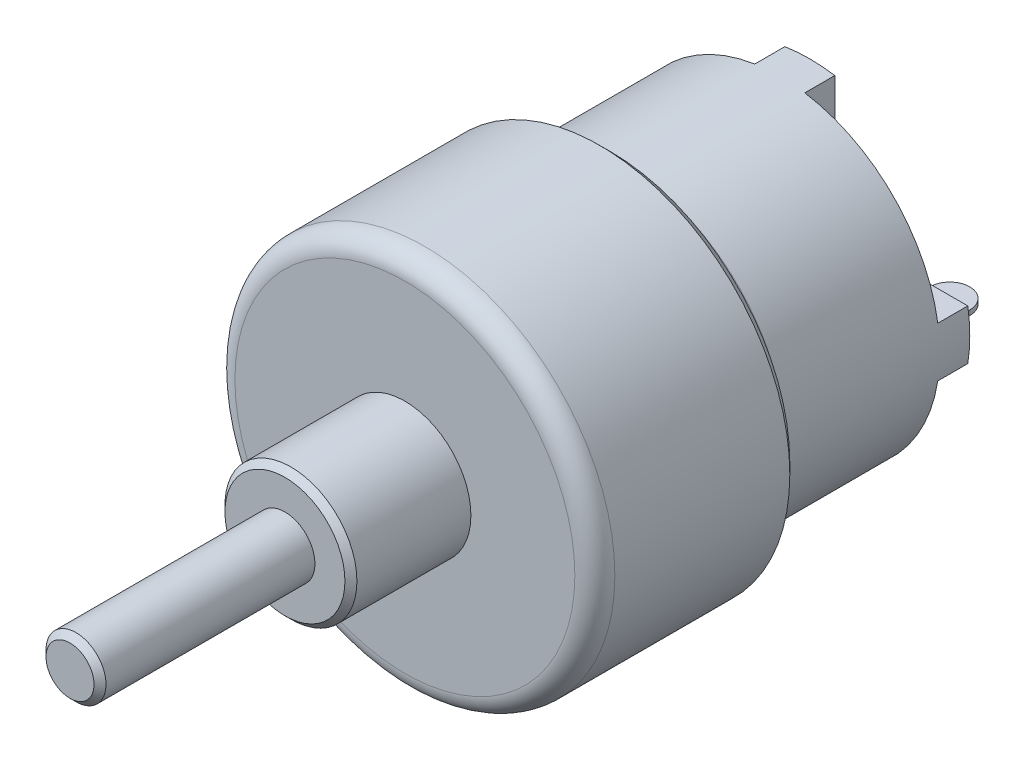
ISO-10303-21;
HEADER;
FILE_DESCRIPTION(('STEP AP214'),'2;1');
FILE_NAME('part.step','',(''),(''),'','','');
FILE_SCHEMA(('AUTOMOTIVE_DESIGN { 1 0 10303 214 1 1 1 1 }'));
ENDSEC;
DATA;
#1=APPLICATION_CONTEXT('core data for automotive mechanical design processes');
#2=APPLICATION_PROTOCOL_DEFINITION('international standard','automotive_design',2000,#1);
#3=PRODUCT_CONTEXT('',#1,'mechanical');
#4=PRODUCT('Part','Part','',(#3));
#5=PRODUCT_RELATED_PRODUCT_CATEGORY('part','',(#4));
#6=PRODUCT_DEFINITION_FORMATION('','',#4);
#7=PRODUCT_DEFINITION_CONTEXT('part definition',#1,'design');
#8=PRODUCT_DEFINITION('design','',#6,#7);
#9=PRODUCT_DEFINITION_SHAPE('','',#8);
#10=(LENGTH_UNIT() NAMED_UNIT(*) SI_UNIT(.MILLI.,.METRE.));
#11=(NAMED_UNIT(*) PLANE_ANGLE_UNIT() SI_UNIT($,.RADIAN.));
#12=(NAMED_UNIT(*) SI_UNIT($,.STERADIAN.) SOLID_ANGLE_UNIT());
#13=UNCERTAINTY_MEASURE_WITH_UNIT(LENGTH_MEASURE(1.E-05),#10,'distance_accuracy_value','');
#14=(GEOMETRIC_REPRESENTATION_CONTEXT(3) GLOBAL_UNCERTAINTY_ASSIGNED_CONTEXT((#13)) GLOBAL_UNIT_ASSIGNED_CONTEXT((#10,
#11,#12)) REPRESENTATION_CONTEXT('',''));
#15=CARTESIAN_POINT('',(0.,0.,0.));
#16=DIRECTION('',(0.,0.,1.));
#17=DIRECTION('',(1.,0.,0.));
#18=AXIS2_PLACEMENT_3D('',#15,#16,#17);
#19=CARTESIAN_POINT('',(0.,0.,-3.));
#20=DIRECTION('',(0.,0.,-1.));
#21=DIRECTION('',(-1.,0.,0.));
#22=AXIS2_PLACEMENT_3D('',#19,#20,#21);
#23=PLANE('',#22);
#24=CARTESIAN_POINT('',(0.,0.,-3.));
#25=DIRECTION('',(0.,0.,-1.));
#26=DIRECTION('',(-1.,0.,0.));
#27=AXIS2_PLACEMENT_3D('',#24,#25,#26);
#28=CIRCLE('',#27,3.);
#29=CARTESIAN_POINT('',(-3.,0.,-3.));
#30=VERTEX_POINT('',#29);
#31=EDGE_CURVE('E275',#30,#30,#28,.T.);
#32=ORIENTED_EDGE('',*,*,#31,.F.);
#33=EDGE_LOOP('',(#32));
#34=FACE_BOUND('',#33,.T.);
#35=CARTESIAN_POINT('',(0.,0.,-3.));
#36=DIRECTION('',(0.,0.,-1.));
#37=DIRECTION('',(-1.,0.,0.));
#38=AXIS2_PLACEMENT_3D('',#35,#36,#37);
#39=CIRCLE('',#38,16.);
#40=CARTESIAN_POINT('',(-2.49999999999999,15.8034806292791,-3.));
#41=VERTEX_POINT('',#40);
#42=CARTESIAN_POINT('',(2.5,15.8034806292791,-3.));
#43=VERTEX_POINT('',#42);
#44=EDGE_CURVE('E308',#41,#43,#39,.T.);
#45=ORIENTED_EDGE('',*,*,#44,.T.);
#46=DIRECTION('',(0.,-1.,0.));
#47=VECTOR('',#46,1.);
#48=CARTESIAN_POINT('',(2.5,15.8034806292791,-3.));
#49=LINE('',#48,#47);
#50=CARTESIAN_POINT('',(2.5,4.00000000000001,-3.));
#51=VERTEX_POINT('',#50);
#52=EDGE_CURVE('E312',#43,#51,#49,.T.);
#53=ORIENTED_EDGE('',*,*,#52,.T.);
#54=CARTESIAN_POINT('',(4.,4.00000000000001,-3.));
#55=DIRECTION('',(0.,0.,-1.));
#56=DIRECTION('',(-1.,0.,0.));
#57=AXIS2_PLACEMENT_3D('',#54,#55,#56);
#58=CIRCLE('',#57,1.5);
#59=CARTESIAN_POINT('',(4.,2.50000000000001,-3.));
#60=VERTEX_POINT('',#59);
#61=EDGE_CURVE('E379',#51,#60,#58,.F.);
#62=ORIENTED_EDGE('',*,*,#61,.T.);
#63=DIRECTION('',(1.,0.,0.));
#64=VECTOR('',#63,1.);
#65=CARTESIAN_POINT('',(-15.8034806292791,2.49999999999994,-3.));
#66=LINE('',#65,#64);
#67=CARTESIAN_POINT('',(15.8034806292791,2.50000000000005,-3.));
#68=VERTEX_POINT('',#67);
#69=EDGE_CURVE('E278',#60,#68,#66,.T.);
#70=ORIENTED_EDGE('',*,*,#69,.T.);
#71=CARTESIAN_POINT('',(0.,0.,-3.));
#72=DIRECTION('',(0.,0.,-1.));
#73=DIRECTION('',(0.,-1.,0.));
#74=AXIS2_PLACEMENT_3D('',#71,#72,#73);
#75=CIRCLE('',#74,16.);
#76=CARTESIAN_POINT('',(15.8034806292791,-2.49999999999994,-3.));
#77=VERTEX_POINT('',#76);
#78=EDGE_CURVE('E281',#68,#77,#75,.T.);
#79=ORIENTED_EDGE('',*,*,#78,.T.);
#80=DIRECTION('',(-1.,0.,0.));
#81=VECTOR('',#80,1.);
#82=CARTESIAN_POINT('',(-15.8034806292791,-2.50000000000005,-3.));
#83=LINE('',#82,#81);
#84=CARTESIAN_POINT('',(3.99999999999999,-2.49999999999998,-3.));
#85=VERTEX_POINT('',#84);
#86=EDGE_CURVE('E287',#77,#85,#83,.T.);
#87=ORIENTED_EDGE('',*,*,#86,.T.);
#88=CARTESIAN_POINT('',(4.,-3.99999999999998,-3.));
#89=DIRECTION('',(0.,0.,-1.));
#90=DIRECTION('',(-1.,0.,0.));
#91=AXIS2_PLACEMENT_3D('',#88,#89,#90);
#92=CIRCLE('',#91,1.5);
#93=CARTESIAN_POINT('',(2.5,-3.99999999999998,-3.));
#94=VERTEX_POINT('',#93);
#95=EDGE_CURVE('E385',#85,#94,#92,.F.);
#96=ORIENTED_EDGE('',*,*,#95,.T.);
#97=CARTESIAN_POINT('',(2.5,-15.8034806292791,-3.));
#98=VERTEX_POINT('',#97);
#99=EDGE_CURVE('E311',#94,#98,#49,.T.);
#100=ORIENTED_EDGE('',*,*,#99,.T.);
#101=CARTESIAN_POINT('',(0.,0.,-3.));
#102=DIRECTION('',(0.,0.,-1.));
#103=DIRECTION('',(-1.,0.,0.));
#104=AXIS2_PLACEMENT_3D('',#101,#102,#103);
#105=CIRCLE('',#104,16.);
#106=CARTESIAN_POINT('',(-2.5,-15.8034806292791,-3.));
#107=VERTEX_POINT('',#106);
#108=EDGE_CURVE('E317',#98,#107,#105,.T.);
#109=ORIENTED_EDGE('',*,*,#108,.T.);
#110=DIRECTION('',(0.,1.,0.));
#111=VECTOR('',#110,1.);
#112=CARTESIAN_POINT('',(-2.49999999999999,15.8034806292791,-3.));
#113=LINE('',#112,#111);
#114=CARTESIAN_POINT('',(-2.5,-4.00000000000001,-3.));
#115=VERTEX_POINT('',#114);
#116=EDGE_CURVE('E316',#107,#115,#113,.T.);
#117=ORIENTED_EDGE('',*,*,#116,.T.);
#118=CARTESIAN_POINT('',(-4.,-4.00000000000001,-3.));
#119=DIRECTION('',(0.,0.,-1.));
#120=DIRECTION('',(-1.,0.,0.));
#121=AXIS2_PLACEMENT_3D('',#118,#119,#120);
#122=CIRCLE('',#121,1.5);
#123=CARTESIAN_POINT('',(-4.,-2.50000000000001,-3.));
#124=VERTEX_POINT('',#123);
#125=EDGE_CURVE('E381',#115,#124,#122,.F.);
#126=ORIENTED_EDGE('',*,*,#125,.T.);
#127=CARTESIAN_POINT('',(-15.8034806292791,-2.50000000000005,-3.));
#128=VERTEX_POINT('',#127);
#129=EDGE_CURVE('E290',#124,#128,#83,.T.);
#130=ORIENTED_EDGE('',*,*,#129,.T.);
#131=CARTESIAN_POINT('',(0.,0.,-3.));
#132=DIRECTION('',(0.,0.,-1.));
#133=DIRECTION('',(0.,-1.,0.));
#134=AXIS2_PLACEMENT_3D('',#131,#132,#133);
#135=CIRCLE('',#134,16.);
#136=CARTESIAN_POINT('',(-15.8034806292791,2.49999999999994,-3.));
#137=VERTEX_POINT('',#136);
#138=EDGE_CURVE('E280',#128,#137,#135,.T.);
#139=ORIENTED_EDGE('',*,*,#138,.T.);
#140=CARTESIAN_POINT('',(-3.99999999999999,2.49999999999998,-3.));
#141=VERTEX_POINT('',#140);
#142=EDGE_CURVE('E284',#137,#141,#66,.T.);
#143=ORIENTED_EDGE('',*,*,#142,.T.);
#144=CARTESIAN_POINT('',(-3.99999999999999,3.99999999999998,-3.));
#145=DIRECTION('',(0.,0.,-1.));
#146=DIRECTION('',(-1.,0.,0.));
#147=AXIS2_PLACEMENT_3D('',#144,#145,#146);
#148=CIRCLE('',#147,1.5);
#149=CARTESIAN_POINT('',(-2.5,3.99999999999998,-3.));
#150=VERTEX_POINT('',#149);
#151=EDGE_CURVE('E277',#141,#150,#148,.F.);
#152=ORIENTED_EDGE('',*,*,#151,.T.);
#153=EDGE_CURVE('E319',#150,#41,#113,.T.);
#154=ORIENTED_EDGE('',*,*,#153,.T.);
#155=EDGE_LOOP('',(#45,#53,#62,#70,#79,#87,#96,#100,#109,#117,#126,#130,#139,#143,#152,#154));
#156=FACE_BOUND('',#155,.T.);
#157=DIRECTION('',(1.,0.,0.));
#158=VECTOR('',#157,1.);
#159=CARTESIAN_POINT('',(-14.,0.250000000000002,-3.));
#160=LINE('',#159,#158);
#161=CARTESIAN_POINT('',(-14.,0.250000000000002,-3.));
#162=VERTEX_POINT('',#161);
#163=CARTESIAN_POINT('',(-10.,0.250000000000001,-3.));
#164=VERTEX_POINT('',#163);
#165=EDGE_CURVE('E251',#162,#164,#160,.T.);
#166=ORIENTED_EDGE('',*,*,#165,.F.);
#167=DIRECTION('',(0.,1.,0.));
#168=VECTOR('',#167,1.);
#169=CARTESIAN_POINT('',(-14.,-0.249999999999998,-3.));
#170=LINE('',#169,#168);
#171=CARTESIAN_POINT('',(-14.,-0.249999999999998,-3.));
#172=VERTEX_POINT('',#171);
#173=EDGE_CURVE('E227',#172,#162,#170,.T.);
#174=ORIENTED_EDGE('',*,*,#173,.F.);
#175=DIRECTION('',(-1.,0.,0.));
#176=VECTOR('',#175,1.);
#177=CARTESIAN_POINT('',(-14.,-0.249999999999998,-3.));
#178=LINE('',#177,#176);
#179=CARTESIAN_POINT('',(-10.,-0.249999999999999,-3.));
#180=VERTEX_POINT('',#179);
#181=EDGE_CURVE('E258',#180,#172,#178,.T.);
#182=ORIENTED_EDGE('',*,*,#181,.F.);
#183=DIRECTION('',(0.,-1.,0.));
#184=VECTOR('',#183,1.);
#185=CARTESIAN_POINT('',(-10.,-0.249999999999999,-3.));
#186=LINE('',#185,#184);
#187=EDGE_CURVE('E260',#164,#180,#186,.T.);
#188=ORIENTED_EDGE('',*,*,#187,.F.);
#189=EDGE_LOOP('',(#166,#174,#182,#188));
#190=FACE_BOUND('',#189,.T.);
#191=DIRECTION('',(1.,0.,0.));
#192=VECTOR('',#191,1.);
#193=CARTESIAN_POINT('',(10.,0.249999999999999,-3.));
#194=LINE('',#193,#192);
#195=CARTESIAN_POINT('',(10.,0.249999999999999,-3.));
#196=VERTEX_POINT('',#195);
#197=CARTESIAN_POINT('',(14.,0.250000000000002,-3.));
#198=VERTEX_POINT('',#197);
#199=EDGE_CURVE('E221',#196,#198,#194,.T.);
#200=ORIENTED_EDGE('',*,*,#199,.F.);
#201=DIRECTION('',(0.,1.,0.));
#202=VECTOR('',#201,1.);
#203=CARTESIAN_POINT('',(10.,-0.250000000000001,-3.));
#204=LINE('',#203,#202);
#205=CARTESIAN_POINT('',(10.,-0.250000000000001,-3.));
#206=VERTEX_POINT('',#205);
#207=EDGE_CURVE('E233',#206,#196,#204,.T.);
#208=ORIENTED_EDGE('',*,*,#207,.F.);
#209=DIRECTION('',(-1.,0.,0.));
#210=VECTOR('',#209,1.);
#211=CARTESIAN_POINT('',(10.,-0.250000000000001,-3.));
#212=LINE('',#211,#210);
#213=CARTESIAN_POINT('',(14.,-0.249999999999998,-3.));
#214=VERTEX_POINT('',#213);
#215=EDGE_CURVE('E243',#214,#206,#212,.T.);
#216=ORIENTED_EDGE('',*,*,#215,.F.);
#217=DIRECTION('',(0.,-1.,0.));
#218=VECTOR('',#217,1.);
#219=CARTESIAN_POINT('',(14.,-0.249999999999998,-3.));
#220=LINE('',#219,#218);
#221=EDGE_CURVE('E241',#198,#214,#220,.T.);
#222=ORIENTED_EDGE('',*,*,#221,.F.);
#223=EDGE_LOOP('',(#200,#208,#216,#222));
#224=FACE_BOUND('',#223,.T.);
#225=ADVANCED_FACE('F44',(#34,#156,#190,#224),#23,.T.);
#226=CARTESIAN_POINT('',(0.,0.,0.));
#227=DIRECTION('',(0.,0.,1.));
#228=DIRECTION('',(1.,0.,0.));
#229=AXIS2_PLACEMENT_3D('',#226,#227,#228);
#230=PLANE('',#229);
#231=DIRECTION('',(0.,1.,0.));
#232=VECTOR('',#231,1.);
#233=CARTESIAN_POINT('',(-2.49999999999999,15.8034806292791,0.));
#234=LINE('',#233,#232);
#235=CARTESIAN_POINT('',(-2.5,3.99999999999998,0.));
#236=VERTEX_POINT('',#235);
#237=CARTESIAN_POINT('',(-2.49999999999999,15.8034806292791,0.));
#238=VERTEX_POINT('',#237);
#239=EDGE_CURVE('E328',#236,#238,#234,.T.);
#240=ORIENTED_EDGE('',*,*,#239,.F.);
#241=CARTESIAN_POINT('',(-3.99999999999999,3.99999999999998,0.));
#242=DIRECTION('',(0.,0.,1.));
#243=DIRECTION('',(1.,0.,0.));
#244=AXIS2_PLACEMENT_3D('',#241,#242,#243);
#245=CIRCLE('',#244,1.5);
#246=CARTESIAN_POINT('',(-3.99999999999999,2.49999999999998,0.));
#247=VERTEX_POINT('',#246);
#248=EDGE_CURVE('E377',#236,#247,#245,.F.);
#249=ORIENTED_EDGE('',*,*,#248,.T.);
#250=DIRECTION('',(1.,0.,0.));
#251=VECTOR('',#250,1.);
#252=CARTESIAN_POINT('',(-15.8034806292791,2.49999999999994,0.));
#253=LINE('',#252,#251);
#254=CARTESIAN_POINT('',(-15.8034806292791,2.49999999999994,0.));
#255=VERTEX_POINT('',#254);
#256=EDGE_CURVE('E292',#255,#247,#253,.T.);
#257=ORIENTED_EDGE('',*,*,#256,.F.);
#258=CARTESIAN_POINT('',(0.,0.,0.));
#259=DIRECTION('',(0.,0.,1.));
#260=DIRECTION('',(1.,0.,0.));
#261=AXIS2_PLACEMENT_3D('',#258,#259,#260);
#262=CIRCLE('',#261,16.);
#263=EDGE_CURVE('E343',#238,#255,#262,.T.);
#264=ORIENTED_EDGE('',*,*,#263,.F.);
#265=EDGE_LOOP('',(#240,#249,#257,#264));
#266=FACE_BOUND('',#265,.T.);
#267=ADVANCED_FACE('F458',(#266),#230,.F.);
#268=DIRECTION('',(-1.,0.,0.));
#269=VECTOR('',#268,1.);
#270=CARTESIAN_POINT('',(-15.8034806292791,-2.50000000000005,0.));
#271=LINE('',#270,#269);
#272=CARTESIAN_POINT('',(-4.,-2.50000000000001,0.));
#273=VERTEX_POINT('',#272);
#274=CARTESIAN_POINT('',(-15.8034806292791,-2.50000000000005,0.));
#275=VERTEX_POINT('',#274);
#276=EDGE_CURVE('E294',#273,#275,#271,.T.);
#277=ORIENTED_EDGE('',*,*,#276,.F.);
#278=CARTESIAN_POINT('',(-4.,-4.00000000000001,0.));
#279=DIRECTION('',(0.,0.,1.));
#280=DIRECTION('',(1.,0.,0.));
#281=AXIS2_PLACEMENT_3D('',#278,#279,#280);
#282=CIRCLE('',#281,1.5);
#283=CARTESIAN_POINT('',(-2.5,-4.00000000000001,0.));
#284=VERTEX_POINT('',#283);
#285=EDGE_CURVE('E367',#273,#284,#282,.F.);
#286=ORIENTED_EDGE('',*,*,#285,.T.);
#287=CARTESIAN_POINT('',(-2.5,-15.8034806292791,0.));
#288=VERTEX_POINT('',#287);
#289=EDGE_CURVE('E315',#288,#284,#234,.T.);
#290=ORIENTED_EDGE('',*,*,#289,.F.);
#291=EDGE_CURVE('E341',#275,#288,#262,.T.);
#292=ORIENTED_EDGE('',*,*,#291,.F.);
#293=EDGE_LOOP('',(#277,#286,#290,#292));
#294=FACE_BOUND('',#293,.T.);
#295=ADVANCED_FACE('F462',(#294),#230,.F.);
#296=CARTESIAN_POINT('',(4.,2.50000000000001,0.));
#297=VERTEX_POINT('',#296);
#298=CARTESIAN_POINT('',(15.8034806292791,2.50000000000005,0.));
#299=VERTEX_POINT('',#298);
#300=EDGE_CURVE('E272',#297,#299,#253,.T.);
#301=ORIENTED_EDGE('',*,*,#300,.F.);
#302=CARTESIAN_POINT('',(4.,4.00000000000001,0.));
#303=DIRECTION('',(0.,0.,1.));
#304=DIRECTION('',(1.,0.,0.));
#305=AXIS2_PLACEMENT_3D('',#302,#303,#304);
#306=CIRCLE('',#305,1.5);
#307=CARTESIAN_POINT('',(2.5,4.00000000000001,0.));
#308=VERTEX_POINT('',#307);
#309=EDGE_CURVE('E354',#297,#308,#306,.F.);
#310=ORIENTED_EDGE('',*,*,#309,.T.);
#311=DIRECTION('',(0.,-1.,0.));
#312=VECTOR('',#311,1.);
#313=CARTESIAN_POINT('',(2.5,15.8034806292791,0.));
#314=LINE('',#313,#312);
#315=CARTESIAN_POINT('',(2.5,15.8034806292791,0.));
#316=VERTEX_POINT('',#315);
#317=EDGE_CURVE('E324',#316,#308,#314,.T.);
#318=ORIENTED_EDGE('',*,*,#317,.F.);
#319=EDGE_CURVE('E338',#299,#316,#262,.T.);
#320=ORIENTED_EDGE('',*,*,#319,.F.);
#321=EDGE_LOOP('',(#301,#310,#318,#320));
#322=FACE_BOUND('',#321,.T.);
#323=ADVANCED_FACE('F625',(#322),#230,.F.);
#324=CARTESIAN_POINT('',(2.5,-3.99999999999998,0.));
#325=VERTEX_POINT('',#324);
#326=CARTESIAN_POINT('',(2.5,-15.8034806292791,0.));
#327=VERTEX_POINT('',#326);
#328=EDGE_CURVE('E310',#325,#327,#314,.T.);
#329=ORIENTED_EDGE('',*,*,#328,.F.);
#330=CARTESIAN_POINT('',(4.,-3.99999999999998,0.));
#331=DIRECTION('',(0.,0.,1.));
#332=DIRECTION('',(1.,0.,0.));
#333=AXIS2_PLACEMENT_3D('',#330,#331,#332);
#334=CIRCLE('',#333,1.5);
#335=CARTESIAN_POINT('',(3.99999999999999,-2.49999999999998,0.));
#336=VERTEX_POINT('',#335);
#337=EDGE_CURVE('E364',#325,#336,#334,.F.);
#338=ORIENTED_EDGE('',*,*,#337,.T.);
#339=CARTESIAN_POINT('',(15.8034806292791,-2.49999999999994,0.));
#340=VERTEX_POINT('',#339);
#341=EDGE_CURVE('E283',#340,#336,#271,.T.);
#342=ORIENTED_EDGE('',*,*,#341,.F.);
#343=EDGE_CURVE('E342',#327,#340,#262,.T.);
#344=ORIENTED_EDGE('',*,*,#343,.F.);
#345=EDGE_LOOP('',(#329,#338,#342,#344));
#346=FACE_BOUND('',#345,.T.);
#347=ADVANCED_FACE('F467',(#346),#230,.F.);
#348=CARTESIAN_POINT('',(2.5,15.8034806292791,-3.));
#349=DIRECTION('',(-1.,0.,0.));
#350=DIRECTION('',(0.,0.,1.));
#351=AXIS2_PLACEMENT_3D('',#348,#349,#350);
#352=PLANE('',#351);
#353=ORIENTED_EDGE('',*,*,#317,.T.);
#354=DIRECTION('',(0.,0.,1.));
#355=VECTOR('',#354,1.);
#356=CARTESIAN_POINT('',(2.5,4.00000000000001,-3.));
#357=LINE('',#356,#355);
#358=EDGE_CURVE('E357',#308,#51,#357,.F.);
#359=ORIENTED_EDGE('',*,*,#358,.T.);
#360=ORIENTED_EDGE('',*,*,#52,.F.);
#361=DIRECTION('',(0.,0.,1.));
#362=VECTOR('',#361,1.);
#363=CARTESIAN_POINT('',(2.5,15.8034806292791,-3.));
#364=LINE('',#363,#362);
#365=EDGE_CURVE('E340',#43,#316,#364,.T.);
#366=ORIENTED_EDGE('',*,*,#365,.T.);
#367=EDGE_LOOP('',(#353,#359,#360,#366));
#368=FACE_BOUND('',#367,.T.);
#369=ADVANCED_FACE('F480',(#368),#352,.F.);
#370=ORIENTED_EDGE('',*,*,#99,.F.);
#371=DIRECTION('',(0.,0.,-1.));
#372=VECTOR('',#371,1.);
#373=CARTESIAN_POINT('',(2.5,-3.99999999999998,0.));
#374=LINE('',#373,#372);
#375=EDGE_CURVE('E365',#94,#325,#374,.F.);
#376=ORIENTED_EDGE('',*,*,#375,.T.);
#377=ORIENTED_EDGE('',*,*,#328,.T.);
#378=DIRECTION('',(0.,0.,1.));
#379=VECTOR('',#378,1.);
#380=CARTESIAN_POINT('',(2.5,-15.8034806292791,-3.));
#381=LINE('',#380,#379);
#382=EDGE_CURVE('E333',#98,#327,#381,.T.);
#383=ORIENTED_EDGE('',*,*,#382,.F.);
#384=EDGE_LOOP('',(#370,#376,#377,#383));
#385=FACE_BOUND('',#384,.T.);
#386=ADVANCED_FACE('F479',(#385),#352,.F.);
#387=CARTESIAN_POINT('',(-2.49999999999999,15.8034806292791,-3.));
#388=DIRECTION('',(1.,0.,0.));
#389=DIRECTION('',(0.,1.,0.));
#390=AXIS2_PLACEMENT_3D('',#387,#388,#389);
#391=PLANE('',#390);
#392=ORIENTED_EDGE('',*,*,#153,.F.);
#393=DIRECTION('',(0.,0.,-1.));
#394=VECTOR('',#393,1.);
#395=CARTESIAN_POINT('',(-2.5,3.99999999999998,0.));
#396=LINE('',#395,#394);
#397=EDGE_CURVE('E376',#150,#236,#396,.F.);
#398=ORIENTED_EDGE('',*,*,#397,.T.);
#399=ORIENTED_EDGE('',*,*,#239,.T.);
#400=DIRECTION('',(0.,0.,1.));
#401=VECTOR('',#400,1.);
#402=CARTESIAN_POINT('',(-2.49999999999999,15.8034806292791,-3.));
#403=LINE('',#402,#401);
#404=EDGE_CURVE('E325',#41,#238,#403,.T.);
#405=ORIENTED_EDGE('',*,*,#404,.F.);
#406=EDGE_LOOP('',(#392,#398,#399,#405));
#407=FACE_BOUND('',#406,.T.);
#408=ADVANCED_FACE('F474',(#407),#391,.F.);
#409=ORIENTED_EDGE('',*,*,#289,.T.);
#410=DIRECTION('',(0.,0.,1.));
#411=VECTOR('',#410,1.);
#412=CARTESIAN_POINT('',(-2.5,-4.00000000000001,-3.));
#413=LINE('',#412,#411);
#414=EDGE_CURVE('E371',#284,#115,#413,.F.);
#415=ORIENTED_EDGE('',*,*,#414,.T.);
#416=ORIENTED_EDGE('',*,*,#116,.F.);
#417=DIRECTION('',(0.,0.,1.));
#418=VECTOR('',#417,1.);
#419=CARTESIAN_POINT('',(-2.5,-15.8034806292791,-3.));
#420=LINE('',#419,#418);
#421=EDGE_CURVE('E331',#107,#288,#420,.T.);
#422=ORIENTED_EDGE('',*,*,#421,.T.);
#423=EDGE_LOOP('',(#409,#415,#416,#422));
#424=FACE_BOUND('',#423,.T.);
#425=ADVANCED_FACE('F478',(#424),#391,.F.);
#426=CARTESIAN_POINT('',(0.,0.,17.));
#427=DIRECTION('',(0.,0.,-1.));
#428=DIRECTION('',(-1.,0.,0.));
#429=AXIS2_PLACEMENT_3D('',#426,#427,#428);
#430=CYLINDRICAL_SURFACE('',#429,16.);
#431=ORIENTED_EDGE('',*,*,#382,.T.);
#432=ORIENTED_EDGE('',*,*,#343,.T.);
#433=DIRECTION('',(0.,0.,1.));
#434=VECTOR('',#433,1.);
#435=CARTESIAN_POINT('',(15.8034806292791,-2.49999999999994,-3.));
#436=LINE('',#435,#434);
#437=EDGE_CURVE('E297',#77,#340,#436,.T.);
#438=ORIENTED_EDGE('',*,*,#437,.F.);
#439=ORIENTED_EDGE('',*,*,#78,.F.);
#440=DIRECTION('',(0.,0.,1.));
#441=VECTOR('',#440,1.);
#442=CARTESIAN_POINT('',(15.8034806292791,2.50000000000005,-3.));
#443=LINE('',#442,#441);
#444=EDGE_CURVE('E305',#68,#299,#443,.T.);
#445=ORIENTED_EDGE('',*,*,#444,.T.);
#446=ORIENTED_EDGE('',*,*,#319,.T.);
#447=ORIENTED_EDGE('',*,*,#365,.F.);
#448=ORIENTED_EDGE('',*,*,#44,.F.);
#449=ORIENTED_EDGE('',*,*,#404,.T.);
#450=ORIENTED_EDGE('',*,*,#263,.T.);
#451=DIRECTION('',(0.,0.,1.));
#452=VECTOR('',#451,1.);
#453=CARTESIAN_POINT('',(-15.8034806292791,2.49999999999994,-3.));
#454=LINE('',#453,#452);
#455=EDGE_CURVE('E304',#137,#255,#454,.T.);
#456=ORIENTED_EDGE('',*,*,#455,.F.);
#457=ORIENTED_EDGE('',*,*,#138,.F.);
#458=DIRECTION('',(0.,0.,1.));
#459=VECTOR('',#458,1.);
#460=CARTESIAN_POINT('',(-15.8034806292791,-2.50000000000005,-3.));
#461=LINE('',#460,#459);
#462=EDGE_CURVE('E293',#128,#275,#461,.T.);
#463=ORIENTED_EDGE('',*,*,#462,.T.);
#464=ORIENTED_EDGE('',*,*,#291,.T.);
#465=ORIENTED_EDGE('',*,*,#421,.F.);
#466=ORIENTED_EDGE('',*,*,#108,.F.);
#467=EDGE_LOOP('',(#431,#432,#438,#439,#445,#446,#447,#448,#449,#450,#456,#457,#463,#464,#465,#466));
#468=FACE_BOUND('',#467,.T.);
#469=CARTESIAN_POINT('',(0.,0.,15.5));
#470=DIRECTION('',(0.,0.,1.));
#471=DIRECTION('',(1.,0.,0.));
#472=AXIS2_PLACEMENT_3D('',#469,#470,#471);
#473=CIRCLE('',#472,16.);
#474=CARTESIAN_POINT('',(16.,0.,15.5));
#475=VERTEX_POINT('',#474);
#476=EDGE_CURVE('E350',#475,#475,#473,.F.);
#477=ORIENTED_EDGE('',*,*,#476,.T.);
#478=EDGE_LOOP('',(#477));
#479=FACE_BOUND('',#478,.T.);
#480=ADVANCED_FACE('F485',(#468,#479),#430,.T.);
#481=CARTESIAN_POINT('',(0.,0.,15.5));
#482=DIRECTION('',(0.,0.,1.));
#483=DIRECTION('',(1.,0.,0.));
#484=AXIS2_PLACEMENT_3D('',#481,#482,#483);
#485=TOROIDAL_SURFACE('',#484,14.5,1.5);
#486=ORIENTED_EDGE('',*,*,#476,.F.);
#487=EDGE_LOOP('',(#486));
#488=FACE_BOUND('',#487,.T.);
#489=CARTESIAN_POINT('',(0.,0.,17.));
#490=DIRECTION('',(0.,0.,1.));
#491=DIRECTION('',(1.,0.,0.));
#492=AXIS2_PLACEMENT_3D('',#489,#490,#491);
#493=CIRCLE('',#492,14.5);
#494=CARTESIAN_POINT('',(14.5,0.,17.));
#495=VERTEX_POINT('',#494);
#496=EDGE_CURVE('E348',#495,#495,#493,.T.);
#497=ORIENTED_EDGE('',*,*,#496,.F.);
#498=EDGE_LOOP('',(#497));
#499=FACE_BOUND('',#498,.T.);
#500=ADVANCED_FACE('F484',(#488,#499),#485,.T.);
#501=CARTESIAN_POINT('',(-15.8034806292791,-2.50000000000005,-3.));
#502=DIRECTION('',(0.,1.,0.));
#503=DIRECTION('',(-1.,0.,0.));
#504=AXIS2_PLACEMENT_3D('',#501,#502,#503);
#505=PLANE('',#504);
#506=ORIENTED_EDGE('',*,*,#129,.F.);
#507=DIRECTION('',(0.,0.,1.));
#508=VECTOR('',#507,1.);
#509=CARTESIAN_POINT('',(-4.,-2.50000000000001,0.));
#510=LINE('',#509,#508);
#511=EDGE_CURVE('E366',#124,#273,#510,.T.);
#512=ORIENTED_EDGE('',*,*,#511,.T.);
#513=ORIENTED_EDGE('',*,*,#276,.T.);
#514=ORIENTED_EDGE('',*,*,#462,.F.);
#515=EDGE_LOOP('',(#506,#512,#513,#514));
#516=FACE_BOUND('',#515,.T.);
#517=ADVANCED_FACE('F490',(#516),#505,.F.);
#518=CARTESIAN_POINT('',(-15.8034806292791,2.49999999999994,-3.));
#519=DIRECTION('',(0.,-1.,0.));
#520=DIRECTION('',(1.,0.,0.));
#521=AXIS2_PLACEMENT_3D('',#518,#519,#520);
#522=PLANE('',#521);
#523=ORIENTED_EDGE('',*,*,#256,.T.);
#524=DIRECTION('',(0.,0.,-1.));
#525=VECTOR('',#524,1.);
#526=CARTESIAN_POINT('',(-3.99999999999999,2.49999999999998,-3.));
#527=LINE('',#526,#525);
#528=EDGE_CURVE('E373',#247,#141,#527,.T.);
#529=ORIENTED_EDGE('',*,*,#528,.T.);
#530=ORIENTED_EDGE('',*,*,#142,.F.);
#531=ORIENTED_EDGE('',*,*,#455,.T.);
#532=EDGE_LOOP('',(#523,#529,#530,#531));
#533=FACE_BOUND('',#532,.T.);
#534=ADVANCED_FACE('F472',(#533),#522,.F.);
#535=ORIENTED_EDGE('',*,*,#69,.F.);
#536=DIRECTION('',(0.,0.,1.));
#537=VECTOR('',#536,1.);
#538=CARTESIAN_POINT('',(4.,2.50000000000001,0.));
#539=LINE('',#538,#537);
#540=EDGE_CURVE('E355',#60,#297,#539,.T.);
#541=ORIENTED_EDGE('',*,*,#540,.T.);
#542=ORIENTED_EDGE('',*,*,#300,.T.);
#543=ORIENTED_EDGE('',*,*,#444,.F.);
#544=EDGE_LOOP('',(#535,#541,#542,#543));
#545=FACE_BOUND('',#544,.T.);
#546=ADVANCED_FACE('F579',(#545),#522,.F.);
#547=ORIENTED_EDGE('',*,*,#341,.T.);
#548=DIRECTION('',(0.,0.,-1.));
#549=VECTOR('',#548,1.);
#550=CARTESIAN_POINT('',(3.99999999999999,-2.49999999999998,-3.));
#551=LINE('',#550,#549);
#552=EDGE_CURVE('E360',#336,#85,#551,.T.);
#553=ORIENTED_EDGE('',*,*,#552,.T.);
#554=ORIENTED_EDGE('',*,*,#86,.F.);
#555=ORIENTED_EDGE('',*,*,#437,.T.);
#556=EDGE_LOOP('',(#547,#553,#554,#555));
#557=FACE_BOUND('',#556,.T.);
#558=ADVANCED_FACE('F492',(#557),#505,.F.);
#559=CARTESIAN_POINT('',(4.,4.00000000000001,-3.));
#560=DIRECTION('',(0.,0.,-1.));
#561=DIRECTION('',(-1.,0.,0.));
#562=AXIS2_PLACEMENT_3D('',#559,#560,#561);
#563=CYLINDRICAL_SURFACE('',#562,1.5);
#564=ORIENTED_EDGE('',*,*,#61,.F.);
#565=ORIENTED_EDGE('',*,*,#358,.F.);
#566=ORIENTED_EDGE('',*,*,#309,.F.);
#567=ORIENTED_EDGE('',*,*,#540,.F.);
#568=EDGE_LOOP('',(#564,#565,#566,#567));
#569=FACE_BOUND('',#568,.T.);
#570=ADVANCED_FACE('F493',(#569),#563,.F.);
#571=CARTESIAN_POINT('',(4.,-3.99999999999998,-3.));
#572=DIRECTION('',(0.,0.,1.));
#573=DIRECTION('',(1.,0.,0.));
#574=AXIS2_PLACEMENT_3D('',#571,#572,#573);
#575=CYLINDRICAL_SURFACE('',#574,1.5);
#576=ORIENTED_EDGE('',*,*,#337,.F.);
#577=ORIENTED_EDGE('',*,*,#375,.F.);
#578=ORIENTED_EDGE('',*,*,#95,.F.);
#579=ORIENTED_EDGE('',*,*,#552,.F.);
#580=EDGE_LOOP('',(#576,#577,#578,#579));
#581=FACE_BOUND('',#580,.T.);
#582=ADVANCED_FACE('F494',(#581),#575,.F.);
#583=CARTESIAN_POINT('',(-4.,-4.00000000000001,-3.));
#584=DIRECTION('',(0.,0.,-1.));
#585=DIRECTION('',(-1.,0.,0.));
#586=AXIS2_PLACEMENT_3D('',#583,#584,#585);
#587=CYLINDRICAL_SURFACE('',#586,1.5);
#588=ORIENTED_EDGE('',*,*,#125,.F.);
#589=ORIENTED_EDGE('',*,*,#414,.F.);
#590=ORIENTED_EDGE('',*,*,#285,.F.);
#591=ORIENTED_EDGE('',*,*,#511,.F.);
#592=EDGE_LOOP('',(#588,#589,#590,#591));
#593=FACE_BOUND('',#592,.T.);
#594=ADVANCED_FACE('F497',(#593),#587,.F.);
#595=CARTESIAN_POINT('',(-3.99999999999999,3.99999999999998,-3.));
#596=DIRECTION('',(0.,0.,1.));
#597=DIRECTION('',(1.,0.,0.));
#598=AXIS2_PLACEMENT_3D('',#595,#596,#597);
#599=CYLINDRICAL_SURFACE('',#598,1.5);
#600=ORIENTED_EDGE('',*,*,#248,.F.);
#601=ORIENTED_EDGE('',*,*,#397,.F.);
#602=ORIENTED_EDGE('',*,*,#151,.F.);
#603=ORIENTED_EDGE('',*,*,#528,.F.);
#604=EDGE_LOOP('',(#600,#601,#602,#603));
#605=FACE_BOUND('',#604,.T.);
#606=ADVANCED_FACE('F503',(#605),#599,.F.);
#607=CARTESIAN_POINT('',(0.,0.,-6.));
#608=DIRECTION('',(0.,0.,1.));
#609=DIRECTION('',(1.,0.,0.));
#610=AXIS2_PLACEMENT_3D('',#607,#608,#609);
#611=CYLINDRICAL_SURFACE('',#610,3.);
#612=CARTESIAN_POINT('',(0.,0.,-5.5));
#613=DIRECTION('',(0.,0.,-1.));
#614=DIRECTION('',(-1.,0.,0.));
#615=AXIS2_PLACEMENT_3D('',#612,#613,#614);
#616=CIRCLE('',#615,3.);
#617=CARTESIAN_POINT('',(-3.,0.,-5.5));
#618=VERTEX_POINT('',#617);
#619=EDGE_CURVE('E386',#618,#618,#616,.F.);
#620=ORIENTED_EDGE('',*,*,#619,.T.);
#621=EDGE_LOOP('',(#620));
#622=FACE_BOUND('',#621,.T.);
#623=ORIENTED_EDGE('',*,*,#31,.T.);
#624=EDGE_LOOP('',(#623));
#625=FACE_BOUND('',#624,.T.);
#626=ADVANCED_FACE('F510',(#622,#625),#611,.T.);
#627=CARTESIAN_POINT('',(0.,0.,-6.));
#628=DIRECTION('',(0.,0.,-1.));
#629=DIRECTION('',(-1.,0.,0.));
#630=AXIS2_PLACEMENT_3D('',#627,#628,#629);
#631=PLANE('',#630);
#632=CARTESIAN_POINT('',(0.,0.,-6.));
#633=DIRECTION('',(0.,0.,-1.));
#634=DIRECTION('',(-1.,0.,0.));
#635=AXIS2_PLACEMENT_3D('',#632,#633,#634);
#636=CIRCLE('',#635,2.5);
#637=CARTESIAN_POINT('',(-2.5,0.,-6.));
#638=VERTEX_POINT('',#637);
#639=EDGE_CURVE('E273',#638,#638,#636,.T.);
#640=ORIENTED_EDGE('',*,*,#639,.T.);
#641=EDGE_LOOP('',(#640));
#642=FACE_BOUND('',#641,.T.);
#643=ADVANCED_FACE('F514',(#642),#631,.T.);
#644=CARTESIAN_POINT('',(0.,0.,-5.5));
#645=DIRECTION('',(0.,0.,-1.));
#646=DIRECTION('',(-1.,0.,0.));
#647=AXIS2_PLACEMENT_3D('',#644,#645,#646);
#648=TOROIDAL_SURFACE('',#647,2.5,0.5);
#649=ORIENTED_EDGE('',*,*,#619,.F.);
#650=EDGE_LOOP('',(#649));
#651=FACE_BOUND('',#650,.T.);
#652=ORIENTED_EDGE('',*,*,#639,.F.);
#653=EDGE_LOOP('',(#652));
#654=FACE_BOUND('',#653,.T.);
#655=ADVANCED_FACE('F508',(#651,#654),#648,.T.);
#656=CARTESIAN_POINT('',(0.,0.,37.5));
#657=DIRECTION('',(0.,0.,-1.));
#658=DIRECTION('',(-1.,0.,0.));
#659=AXIS2_PLACEMENT_3D('',#656,#657,#658);
#660=CYLINDRICAL_SURFACE('',#659,19.);
#661=CARTESIAN_POINT('',(0.,0.,35.5));
#662=DIRECTION('',(0.,0.,1.));
#663=DIRECTION('',(1.,0.,0.));
#664=AXIS2_PLACEMENT_3D('',#661,#662,#663);
#665=CIRCLE('',#664,19.);
#666=CARTESIAN_POINT('',(19.,0.,35.5));
#667=VERTEX_POINT('',#666);
#668=EDGE_CURVE('E427',#667,#667,#665,.F.);
#669=ORIENTED_EDGE('',*,*,#668,.T.);
#670=EDGE_LOOP('',(#669));
#671=FACE_BOUND('',#670,.T.);
#672=CARTESIAN_POINT('',(0.,0.,18.));
#673=DIRECTION('',(0.,0.,1.));
#674=DIRECTION('',(1.,0.,0.));
#675=AXIS2_PLACEMENT_3D('',#672,#673,#674);
#676=CIRCLE('',#675,19.);
#677=CARTESIAN_POINT('',(19.,0.,18.));
#678=VERTEX_POINT('',#677);
#679=EDGE_CURVE('E394',#678,#678,#676,.T.);
#680=ORIENTED_EDGE('',*,*,#679,.T.);
#681=EDGE_LOOP('',(#680));
#682=FACE_BOUND('',#681,.T.);
#683=ADVANCED_FACE('F515',(#671,#682),#660,.T.);
#684=CARTESIAN_POINT('',(0.,0.,37.5));
#685=DIRECTION('',(0.,0.,1.));
#686=DIRECTION('',(1.,0.,0.));
#687=AXIS2_PLACEMENT_3D('',#684,#685,#686);
#688=PLANE('',#687);
#689=CARTESIAN_POINT('',(0.,0.,37.5));
#690=DIRECTION('',(0.,0.,1.));
#691=DIRECTION('',(1.,0.,0.));
#692=AXIS2_PLACEMENT_3D('',#689,#690,#691);
#693=CIRCLE('',#692,6.6);
#694=CARTESIAN_POINT('',(6.6,0.,37.5));
#695=VERTEX_POINT('',#694);
#696=EDGE_CURVE('E430',#695,#695,#693,.T.);
#697=ORIENTED_EDGE('',*,*,#696,.F.);
#698=EDGE_LOOP('',(#697));
#699=FACE_BOUND('',#698,.T.);
#700=CARTESIAN_POINT('',(0.,0.,37.5));
#701=DIRECTION('',(0.,0.,1.));
#702=DIRECTION('',(1.,0.,0.));
#703=AXIS2_PLACEMENT_3D('',#700,#701,#702);
#704=CIRCLE('',#703,17.);
#705=CARTESIAN_POINT('',(17.,0.,37.5));
#706=VERTEX_POINT('',#705);
#707=EDGE_CURVE('E423',#706,#706,#704,.T.);
#708=ORIENTED_EDGE('',*,*,#707,.T.);
#709=EDGE_LOOP('',(#708));
#710=FACE_BOUND('',#709,.T.);
#711=ADVANCED_FACE('F551',(#699,#710),#688,.T.);
#712=CARTESIAN_POINT('',(0.,0.,17.));
#713=DIRECTION('',(0.,0.,1.));
#714=DIRECTION('',(1.,0.,0.));
#715=AXIS2_PLACEMENT_3D('',#712,#713,#714);
#716=PLANE('',#715);
#717=CARTESIAN_POINT('',(0.,0.,17.));
#718=DIRECTION('',(0.,0.,1.));
#719=DIRECTION('',(1.,0.,0.));
#720=AXIS2_PLACEMENT_3D('',#717,#718,#719);
#721=CIRCLE('',#720,18.);
#722=CARTESIAN_POINT('',(18.,0.,17.));
#723=VERTEX_POINT('',#722);
#724=EDGE_CURVE('E391',#723,#723,#721,.F.);
#725=ORIENTED_EDGE('',*,*,#724,.T.);
#726=EDGE_LOOP('',(#725));
#727=FACE_BOUND('',#726,.T.);
#728=ORIENTED_EDGE('',*,*,#496,.T.);
#729=EDGE_LOOP('',(#728));
#730=FACE_BOUND('',#729,.T.);
#731=ADVANCED_FACE('F516',(#727,#730),#716,.F.);
#732=CARTESIAN_POINT('',(0.,0.,18.));
#733=DIRECTION('',(0.,0.,1.));
#734=DIRECTION('',(1.,0.,0.));
#735=AXIS2_PLACEMENT_3D('',#732,#733,#734);
#736=CONICAL_SURFACE('',#735,19.,0.785398163397452);
#737=ORIENTED_EDGE('',*,*,#724,.F.);
#738=EDGE_LOOP('',(#737));
#739=FACE_BOUND('',#738,.T.);
#740=ORIENTED_EDGE('',*,*,#679,.F.);
#741=EDGE_LOOP('',(#740));
#742=FACE_BOUND('',#741,.T.);
#743=ADVANCED_FACE('F513',(#739,#742),#736,.T.);
#744=CARTESIAN_POINT('',(-14.,-0.249999999999998,-7.));
#745=DIRECTION('',(1.,0.,0.));
#746=DIRECTION('',(0.,0.,-1.));
#747=AXIS2_PLACEMENT_3D('',#744,#745,#746);
#748=PLANE('',#747);
#749=DIRECTION('',(0.,0.,1.));
#750=VECTOR('',#749,1.);
#751=CARTESIAN_POINT('',(-14.,0.250000000000002,-7.));
#752=LINE('',#751,#750);
#753=CARTESIAN_POINT('',(-14.,0.250000000000002,-5.));
#754=VERTEX_POINT('',#753);
#755=EDGE_CURVE('E268',#754,#162,#752,.T.);
#756=ORIENTED_EDGE('',*,*,#755,.F.);
#757=DIRECTION('',(0.,1.,0.));
#758=VECTOR('',#757,1.);
#759=CARTESIAN_POINT('',(-14.,-0.249999999999998,-5.));
#760=LINE('',#759,#758);
#761=CARTESIAN_POINT('',(-14.,-0.249999999999998,-5.));
#762=VERTEX_POINT('',#761);
#763=EDGE_CURVE('E418',#754,#762,#760,.F.);
#764=ORIENTED_EDGE('',*,*,#763,.T.);
#765=DIRECTION('',(0.,0.,1.));
#766=VECTOR('',#765,1.);
#767=CARTESIAN_POINT('',(-14.,-0.249999999999998,-7.));
#768=LINE('',#767,#766);
#769=EDGE_CURVE('E262',#762,#172,#768,.T.);
#770=ORIENTED_EDGE('',*,*,#769,.T.);
#771=ORIENTED_EDGE('',*,*,#173,.T.);
#772=EDGE_LOOP('',(#756,#764,#770,#771));
#773=FACE_BOUND('',#772,.T.);
#774=ADVANCED_FACE('F519',(#773),#748,.F.);
#775=CARTESIAN_POINT('',(-14.,0.250000000000002,-7.));
#776=DIRECTION('',(0.,-1.,0.));
#777=DIRECTION('',(1.,0.,0.));
#778=AXIS2_PLACEMENT_3D('',#775,#776,#777);
#779=PLANE('',#778);
#780=DIRECTION('',(0.,0.,1.));
#781=VECTOR('',#780,1.);
#782=CARTESIAN_POINT('',(-10.,0.250000000000001,-7.));
#783=LINE('',#782,#781);
#784=CARTESIAN_POINT('',(-10.,0.250000000000001,-5.));
#785=VERTEX_POINT('',#784);
#786=EDGE_CURVE('E270',#785,#164,#783,.T.);
#787=ORIENTED_EDGE('',*,*,#786,.F.);
#788=CARTESIAN_POINT('',(-12.,0.250000000000001,-5.));
#789=DIRECTION('',(0.,-1.,0.));
#790=DIRECTION('',(1.,0.,0.));
#791=AXIS2_PLACEMENT_3D('',#788,#789,#790);
#792=CIRCLE('',#791,2.);
#793=CARTESIAN_POINT('',(-12.,0.250000000000001,-7.));
#794=VERTEX_POINT('',#793);
#795=EDGE_CURVE('E63',#785,#794,#792,.F.);
#796=ORIENTED_EDGE('',*,*,#795,.T.);
#797=CARTESIAN_POINT('',(-12.,0.250000000000001,-5.));
#798=DIRECTION('',(0.,-1.,0.));
#799=DIRECTION('',(1.,0.,0.));
#800=AXIS2_PLACEMENT_3D('',#797,#798,#799);
#801=CIRCLE('',#800,2.);
#802=EDGE_CURVE('E58',#794,#754,#801,.F.);
#803=ORIENTED_EDGE('',*,*,#802,.T.);
#804=ORIENTED_EDGE('',*,*,#755,.T.);
#805=ORIENTED_EDGE('',*,*,#165,.T.);
#806=EDGE_LOOP('',(#787,#796,#803,#804,#805));
#807=FACE_BOUND('',#806,.T.);
#808=ADVANCED_FACE('F844',(#807),#779,.F.);
#809=CARTESIAN_POINT('',(-10.,-0.249999999999999,-7.));
#810=DIRECTION('',(-1.,0.,0.));
#811=DIRECTION('',(0.,0.,1.));
#812=AXIS2_PLACEMENT_3D('',#809,#810,#811);
#813=PLANE('',#812);
#814=DIRECTION('',(0.,0.,1.));
#815=VECTOR('',#814,1.);
#816=CARTESIAN_POINT('',(-10.,-0.249999999999999,-7.));
#817=LINE('',#816,#815);
#818=CARTESIAN_POINT('',(-10.,-0.249999999999999,-5.));
#819=VERTEX_POINT('',#818);
#820=EDGE_CURVE('E261',#819,#180,#817,.T.);
#821=ORIENTED_EDGE('',*,*,#820,.F.);
#822=DIRECTION('',(0.,-1.,0.));
#823=VECTOR('',#822,1.);
#824=CARTESIAN_POINT('',(-10.,0.250000000000001,-5.));
#825=LINE('',#824,#823);
#826=EDGE_CURVE('E415',#819,#785,#825,.F.);
#827=ORIENTED_EDGE('',*,*,#826,.T.);
#828=ORIENTED_EDGE('',*,*,#786,.T.);
#829=ORIENTED_EDGE('',*,*,#187,.T.);
#830=EDGE_LOOP('',(#821,#827,#828,#829));
#831=FACE_BOUND('',#830,.T.);
#832=ADVANCED_FACE('F838',(#831),#813,.F.);
#833=CARTESIAN_POINT('',(-14.,-0.249999999999998,-7.));
#834=DIRECTION('',(0.,1.,0.));
#835=DIRECTION('',(-1.,0.,0.));
#836=AXIS2_PLACEMENT_3D('',#833,#834,#835);
#837=PLANE('',#836);
#838=CARTESIAN_POINT('',(-12.,-0.249999999999999,-5.));
#839=DIRECTION('',(0.,1.,0.));
#840=DIRECTION('',(-1.,0.,0.));
#841=AXIS2_PLACEMENT_3D('',#838,#839,#840);
#842=CIRCLE('',#841,2.);
#843=CARTESIAN_POINT('',(-12.,-0.249999999999999,-7.));
#844=VERTEX_POINT('',#843);
#845=EDGE_CURVE('E408',#762,#844,#842,.F.);
#846=ORIENTED_EDGE('',*,*,#845,.T.);
#847=CARTESIAN_POINT('',(-12.,-0.249999999999999,-5.));
#848=DIRECTION('',(0.,1.,0.));
#849=DIRECTION('',(-1.,0.,0.));
#850=AXIS2_PLACEMENT_3D('',#847,#848,#849);
#851=CIRCLE('',#850,2.);
#852=EDGE_CURVE('E414',#844,#819,#851,.F.);
#853=ORIENTED_EDGE('',*,*,#852,.T.);
#854=ORIENTED_EDGE('',*,*,#820,.T.);
#855=ORIENTED_EDGE('',*,*,#181,.T.);
#856=ORIENTED_EDGE('',*,*,#769,.F.);
#857=EDGE_LOOP('',(#846,#853,#854,#855,#856));
#858=FACE_BOUND('',#857,.T.);
#859=ADVANCED_FACE('F840',(#858),#837,.F.);
#860=CARTESIAN_POINT('',(10.,-0.250000000000001,-7.));
#861=DIRECTION('',(1.,0.,0.));
#862=DIRECTION('',(0.,0.,-1.));
#863=AXIS2_PLACEMENT_3D('',#860,#861,#862);
#864=PLANE('',#863);
#865=DIRECTION('',(0.,0.,1.));
#866=VECTOR('',#865,1.);
#867=CARTESIAN_POINT('',(10.,0.249999999999999,-7.));
#868=LINE('',#867,#866);
#869=CARTESIAN_POINT('',(10.,0.249999999999999,-5.));
#870=VERTEX_POINT('',#869);
#871=EDGE_CURVE('E218',#870,#196,#868,.T.);
#872=ORIENTED_EDGE('',*,*,#871,.F.);
#873=DIRECTION('',(0.,1.,0.));
#874=VECTOR('',#873,1.);
#875=CARTESIAN_POINT('',(10.,-0.250000000000001,-5.));
#876=LINE('',#875,#874);
#877=CARTESIAN_POINT('',(10.,-0.250000000000001,-5.));
#878=VERTEX_POINT('',#877);
#879=EDGE_CURVE('E409',#870,#878,#876,.F.);
#880=ORIENTED_EDGE('',*,*,#879,.T.);
#881=DIRECTION('',(0.,0.,1.));
#882=VECTOR('',#881,1.);
#883=CARTESIAN_POINT('',(10.,-0.250000000000001,-7.));
#884=LINE('',#883,#882);
#885=EDGE_CURVE('E234',#878,#206,#884,.T.);
#886=ORIENTED_EDGE('',*,*,#885,.T.);
#887=ORIENTED_EDGE('',*,*,#207,.T.);
#888=EDGE_LOOP('',(#872,#880,#886,#887));
#889=FACE_BOUND('',#888,.T.);
#890=ADVANCED_FACE('F235',(#889),#864,.F.);
#891=CARTESIAN_POINT('',(10.,0.249999999999999,-7.));
#892=DIRECTION('',(0.,-1.,0.));
#893=DIRECTION('',(1.,0.,0.));
#894=AXIS2_PLACEMENT_3D('',#891,#892,#893);
#895=PLANE('',#894);
#896=DIRECTION('',(0.,0.,1.));
#897=VECTOR('',#896,1.);
#898=CARTESIAN_POINT('',(14.,0.250000000000002,-7.));
#899=LINE('',#898,#897);
#900=CARTESIAN_POINT('',(14.,0.250000000000002,-5.));
#901=VERTEX_POINT('',#900);
#902=EDGE_CURVE('E226',#901,#198,#899,.T.);
#903=ORIENTED_EDGE('',*,*,#902,.F.);
#904=CARTESIAN_POINT('',(12.,0.25,-5.));
#905=DIRECTION('',(0.,-1.,0.));
#906=DIRECTION('',(1.,0.,0.));
#907=AXIS2_PLACEMENT_3D('',#904,#905,#906);
#908=CIRCLE('',#907,2.);
#909=CARTESIAN_POINT('',(12.,0.25,-7.));
#910=VERTEX_POINT('',#909);
#911=EDGE_CURVE('E407',#901,#910,#908,.F.);
#912=ORIENTED_EDGE('',*,*,#911,.T.);
#913=CARTESIAN_POINT('',(12.,0.25,-5.));
#914=DIRECTION('',(0.,-1.,0.));
#915=DIRECTION('',(1.,0.,0.));
#916=AXIS2_PLACEMENT_3D('',#913,#914,#915);
#917=CIRCLE('',#916,2.);
#918=EDGE_CURVE('E223',#910,#870,#917,.F.);
#919=ORIENTED_EDGE('',*,*,#918,.T.);
#920=ORIENTED_EDGE('',*,*,#871,.T.);
#921=ORIENTED_EDGE('',*,*,#199,.T.);
#922=EDGE_LOOP('',(#903,#912,#919,#920,#921));
#923=FACE_BOUND('',#922,.T.);
#924=ADVANCED_FACE('F220',(#923),#895,.F.);
#925=CARTESIAN_POINT('',(14.,-0.249999999999998,-7.));
#926=DIRECTION('',(-1.,0.,0.));
#927=DIRECTION('',(0.,0.,1.));
#928=AXIS2_PLACEMENT_3D('',#925,#926,#927);
#929=PLANE('',#928);
#930=DIRECTION('',(0.,0.,1.));
#931=VECTOR('',#930,1.);
#932=CARTESIAN_POINT('',(14.,-0.249999999999998,-7.));
#933=LINE('',#932,#931);
#934=CARTESIAN_POINT('',(14.,-0.249999999999998,-5.));
#935=VERTEX_POINT('',#934);
#936=EDGE_CURVE('E248',#935,#214,#933,.T.);
#937=ORIENTED_EDGE('',*,*,#936,.F.);
#938=DIRECTION('',(0.,-1.,0.));
#939=VECTOR('',#938,1.);
#940=CARTESIAN_POINT('',(14.,0.250000000000002,-5.));
#941=LINE('',#940,#939);
#942=EDGE_CURVE('E405',#935,#901,#941,.F.);
#943=ORIENTED_EDGE('',*,*,#942,.T.);
#944=ORIENTED_EDGE('',*,*,#902,.T.);
#945=ORIENTED_EDGE('',*,*,#221,.T.);
#946=EDGE_LOOP('',(#937,#943,#944,#945));
#947=FACE_BOUND('',#946,.T.);
#948=ADVANCED_FACE('F828',(#947),#929,.F.);
#949=CARTESIAN_POINT('',(10.,-0.250000000000001,-7.));
#950=DIRECTION('',(0.,1.,0.));
#951=DIRECTION('',(-1.,0.,0.));
#952=AXIS2_PLACEMENT_3D('',#949,#950,#951);
#953=PLANE('',#952);
#954=CARTESIAN_POINT('',(12.,-0.25,-5.));
#955=DIRECTION('',(0.,1.,0.));
#956=DIRECTION('',(-1.,0.,0.));
#957=AXIS2_PLACEMENT_3D('',#954,#955,#956);
#958=CIRCLE('',#957,2.);
#959=CARTESIAN_POINT('',(12.,-0.25,-7.));
#960=VERTEX_POINT('',#959);
#961=EDGE_CURVE('E397',#878,#960,#958,.F.);
#962=ORIENTED_EDGE('',*,*,#961,.T.);
#963=CARTESIAN_POINT('',(12.,-0.25,-5.));
#964=DIRECTION('',(0.,1.,0.));
#965=DIRECTION('',(-1.,0.,0.));
#966=AXIS2_PLACEMENT_3D('',#963,#964,#965);
#967=CIRCLE('',#966,2.);
#968=EDGE_CURVE('E399',#960,#935,#967,.F.);
#969=ORIENTED_EDGE('',*,*,#968,.T.);
#970=ORIENTED_EDGE('',*,*,#936,.T.);
#971=ORIENTED_EDGE('',*,*,#215,.T.);
#972=ORIENTED_EDGE('',*,*,#885,.F.);
#973=EDGE_LOOP('',(#962,#969,#970,#971,#972));
#974=FACE_BOUND('',#973,.T.);
#975=ADVANCED_FACE('F528',(#974),#953,.F.);
#976=CARTESIAN_POINT('',(12.,0.,-5.));
#977=DIRECTION('',(0.,-1.,0.));
#978=DIRECTION('',(0.,0.,-1.));
#979=AXIS2_PLACEMENT_3D('',#976,#977,#978);
#980=CYLINDRICAL_SURFACE('',#979,2.);
#981=ORIENTED_EDGE('',*,*,#879,.F.);
#982=ORIENTED_EDGE('',*,*,#918,.F.);
#983=DIRECTION('',(0.,1.,0.));
#984=VECTOR('',#983,1.);
#985=CARTESIAN_POINT('',(12.,0.249999999999999,-7.));
#986=LINE('',#985,#984);
#987=EDGE_CURVE('E238',#960,#910,#986,.T.);
#988=ORIENTED_EDGE('',*,*,#987,.F.);
#989=ORIENTED_EDGE('',*,*,#961,.F.);
#990=EDGE_LOOP('',(#981,#982,#988,#989));
#991=FACE_BOUND('',#990,.T.);
#992=ADVANCED_FACE('F521',(#991),#980,.T.);
#993=CARTESIAN_POINT('',(12.,0.,-5.));
#994=DIRECTION('',(0.,1.,0.));
#995=DIRECTION('',(0.,0.,1.));
#996=AXIS2_PLACEMENT_3D('',#993,#994,#995);
#997=CYLINDRICAL_SURFACE('',#996,2.);
#998=ORIENTED_EDGE('',*,*,#911,.F.);
#999=ORIENTED_EDGE('',*,*,#942,.F.);
#1000=ORIENTED_EDGE('',*,*,#968,.F.);
#1001=ORIENTED_EDGE('',*,*,#987,.T.);
#1002=EDGE_LOOP('',(#998,#999,#1000,#1001));
#1003=FACE_BOUND('',#1002,.T.);
#1004=ADVANCED_FACE('F523',(#1003),#997,.T.);
#1005=CARTESIAN_POINT('',(-12.,0.,-5.));
#1006=DIRECTION('',(0.,-1.,0.));
#1007=DIRECTION('',(0.,0.,-1.));
#1008=AXIS2_PLACEMENT_3D('',#1005,#1006,#1007);
#1009=CYLINDRICAL_SURFACE('',#1008,2.);
#1010=ORIENTED_EDGE('',*,*,#763,.F.);
#1011=ORIENTED_EDGE('',*,*,#802,.F.);
#1012=DIRECTION('',(0.,1.,0.));
#1013=VECTOR('',#1012,1.);
#1014=CARTESIAN_POINT('',(-12.,0.250000000000002,-7.));
#1015=LINE('',#1014,#1013);
#1016=EDGE_CURVE('E425',#844,#794,#1015,.T.);
#1017=ORIENTED_EDGE('',*,*,#1016,.F.);
#1018=ORIENTED_EDGE('',*,*,#845,.F.);
#1019=EDGE_LOOP('',(#1010,#1011,#1017,#1018));
#1020=FACE_BOUND('',#1019,.T.);
#1021=ADVANCED_FACE('F525',(#1020),#1009,.T.);
#1022=CARTESIAN_POINT('',(-12.,0.,-5.));
#1023=DIRECTION('',(0.,1.,0.));
#1024=DIRECTION('',(0.,0.,1.));
#1025=AXIS2_PLACEMENT_3D('',#1022,#1023,#1024);
#1026=CYLINDRICAL_SURFACE('',#1025,2.);
#1027=ORIENTED_EDGE('',*,*,#795,.F.);
#1028=ORIENTED_EDGE('',*,*,#826,.F.);
#1029=ORIENTED_EDGE('',*,*,#852,.F.);
#1030=ORIENTED_EDGE('',*,*,#1016,.T.);
#1031=EDGE_LOOP('',(#1027,#1028,#1029,#1030));
#1032=FACE_BOUND('',#1031,.T.);
#1033=ADVANCED_FACE('F532',(#1032),#1026,.T.);
#1034=CARTESIAN_POINT('',(0.,0.,35.5));
#1035=DIRECTION('',(0.,0.,1.));
#1036=DIRECTION('',(1.,0.,0.));
#1037=AXIS2_PLACEMENT_3D('',#1034,#1035,#1036);
#1038=TOROIDAL_SURFACE('',#1037,17.,2.);
#1039=ORIENTED_EDGE('',*,*,#668,.F.);
#1040=EDGE_LOOP('',(#1039));
#1041=FACE_BOUND('',#1040,.T.);
#1042=ORIENTED_EDGE('',*,*,#707,.F.);
#1043=EDGE_LOOP('',(#1042));
#1044=FACE_BOUND('',#1043,.T.);
#1045=ADVANCED_FACE('F534',(#1041,#1044),#1038,.T.);
#1046=CARTESIAN_POINT('',(0.,0.,49.5));
#1047=DIRECTION('',(0.,0.,-1.));
#1048=DIRECTION('',(-1.,0.,0.));
#1049=AXIS2_PLACEMENT_3D('',#1046,#1047,#1048);
#1050=CYLINDRICAL_SURFACE('',#1049,6.6);
#1051=CARTESIAN_POINT('',(0.,0.,48.9));
#1052=DIRECTION('',(0.,0.,1.));
#1053=DIRECTION('',(1.,0.,0.));
#1054=AXIS2_PLACEMENT_3D('',#1051,#1052,#1053);
#1055=CIRCLE('',#1054,6.6);
#1056=CARTESIAN_POINT('',(6.6,0.,48.9));
#1057=VERTEX_POINT('',#1056);
#1058=EDGE_CURVE('E11',#1057,#1057,#1055,.F.);
#1059=ORIENTED_EDGE('',*,*,#1058,.T.);
#1060=EDGE_LOOP('',(#1059));
#1061=FACE_BOUND('',#1060,.T.);
#1062=ORIENTED_EDGE('',*,*,#696,.T.);
#1063=EDGE_LOOP('',(#1062));
#1064=FACE_BOUND('',#1063,.T.);
#1065=ADVANCED_FACE('F538',(#1061,#1064),#1050,.T.);
#1066=CARTESIAN_POINT('',(0.,0.,49.5));
#1067=DIRECTION('',(0.,0.,1.));
#1068=DIRECTION('',(1.,0.,0.));
#1069=AXIS2_PLACEMENT_3D('',#1066,#1067,#1068);
#1070=PLANE('',#1069);
#1071=CARTESIAN_POINT('',(0.,0.,49.5));
#1072=DIRECTION('',(0.,0.,1.));
#1073=DIRECTION('',(1.,0.,0.));
#1074=AXIS2_PLACEMENT_3D('',#1071,#1072,#1073);
#1075=CIRCLE('',#1074,6.00000000000002);
#1076=CARTESIAN_POINT('',(6.00000000000002,0.,49.5));
#1077=VERTEX_POINT('',#1076);
#1078=EDGE_CURVE('E52',#1077,#1077,#1075,.T.);
#1079=ORIENTED_EDGE('',*,*,#1078,.T.);
#1080=EDGE_LOOP('',(#1079));
#1081=FACE_BOUND('',#1080,.T.);
#1082=CARTESIAN_POINT('',(0.,0.,49.5));
#1083=DIRECTION('',(0.,0.,1.));
#1084=DIRECTION('',(1.,0.,0.));
#1085=AXIS2_PLACEMENT_3D('',#1082,#1083,#1084);
#1086=CIRCLE('',#1085,3.);
#1087=CARTESIAN_POINT('',(3.,0.,49.5));
#1088=VERTEX_POINT('',#1087);
#1089=EDGE_CURVE('E433',#1088,#1088,#1086,.T.);
#1090=ORIENTED_EDGE('',*,*,#1089,.F.);
#1091=EDGE_LOOP('',(#1090));
#1092=FACE_BOUND('',#1091,.T.);
#1093=ADVANCED_FACE('F445',(#1081,#1092),#1070,.T.);
#1094=CARTESIAN_POINT('',(0.,0.,71.));
#1095=DIRECTION('',(0.,0.,-1.));
#1096=DIRECTION('',(-1.,0.,0.));
#1097=AXIS2_PLACEMENT_3D('',#1094,#1095,#1096);
#1098=CYLINDRICAL_SURFACE('',#1097,3.);
#1099=CARTESIAN_POINT('',(0.,0.,70.4));
#1100=DIRECTION('',(0.,0.,1.));
#1101=DIRECTION('',(1.,0.,0.));
#1102=AXIS2_PLACEMENT_3D('',#1099,#1100,#1101);
#1103=CIRCLE('',#1102,3.);
#1104=CARTESIAN_POINT('',(3.,0.,70.4));
#1105=VERTEX_POINT('',#1104);
#1106=EDGE_CURVE('E440',#1105,#1105,#1103,.F.);
#1107=ORIENTED_EDGE('',*,*,#1106,.T.);
#1108=EDGE_LOOP('',(#1107));
#1109=FACE_BOUND('',#1108,.T.);
#1110=ORIENTED_EDGE('',*,*,#1089,.T.);
#1111=EDGE_LOOP('',(#1110));
#1112=FACE_BOUND('',#1111,.T.);
#1113=ADVANCED_FACE('F782',(#1109,#1112),#1098,.T.);
#1114=CARTESIAN_POINT('',(0.,0.,71.));
#1115=DIRECTION('',(0.,0.,1.));
#1116=DIRECTION('',(1.,0.,0.));
#1117=AXIS2_PLACEMENT_3D('',#1114,#1115,#1116);
#1118=PLANE('',#1117);
#1119=CARTESIAN_POINT('',(0.,0.,71.));
#1120=DIRECTION('',(0.,0.,1.));
#1121=DIRECTION('',(1.,0.,0.));
#1122=AXIS2_PLACEMENT_3D('',#1119,#1120,#1121);
#1123=CIRCLE('',#1122,2.4);
#1124=CARTESIAN_POINT('',(2.4,0.,71.));
#1125=VERTEX_POINT('',#1124);
#1126=EDGE_CURVE('E432',#1125,#1125,#1123,.T.);
#1127=ORIENTED_EDGE('',*,*,#1126,.T.);
#1128=EDGE_LOOP('',(#1127));
#1129=FACE_BOUND('',#1128,.T.);
#1130=ADVANCED_FACE('F455',(#1129),#1118,.T.);
#1131=CARTESIAN_POINT('',(0.,0.,71.));
#1132=DIRECTION('',(0.,0.,-1.));
#1133=DIRECTION('',(-1.,0.,0.));
#1134=AXIS2_PLACEMENT_3D('',#1131,#1132,#1133);
#1135=CONICAL_SURFACE('',#1134,2.4,0.785398163397435);
#1136=ORIENTED_EDGE('',*,*,#1106,.F.);
#1137=EDGE_LOOP('',(#1136));
#1138=FACE_BOUND('',#1137,.T.);
#1139=ORIENTED_EDGE('',*,*,#1126,.F.);
#1140=EDGE_LOOP('',(#1139));
#1141=FACE_BOUND('',#1140,.T.);
#1142=ADVANCED_FACE('F447',(#1138,#1141),#1135,.T.);
#1143=CARTESIAN_POINT('',(0.,0.,49.5));
#1144=DIRECTION('',(0.,0.,-1.));
#1145=DIRECTION('',(-1.,0.,0.));
#1146=AXIS2_PLACEMENT_3D('',#1143,#1144,#1145);
#1147=CONICAL_SURFACE('',#1146,6.00000000000002,0.785398163397436);
#1148=ORIENTED_EDGE('',*,*,#1058,.F.);
#1149=EDGE_LOOP('',(#1148));
#1150=FACE_BOUND('',#1149,.T.);
#1151=ORIENTED_EDGE('',*,*,#1078,.F.);
#1152=EDGE_LOOP('',(#1151));
#1153=FACE_BOUND('',#1152,.T.);
#1154=ADVANCED_FACE('F50',(#1150,#1153),#1147,.T.);
#1155=CLOSED_SHELL('',(#225,#267,#295,#323,#347,#369,#386,#408,#425,#480,#500,#517,#534,#546,
#558,#570,#582,#594,#606,#626,#643,#655,#683,#711,#731,#743,#774,#808,#832,#859,#890,#924,#948,
#975,#992,#1004,#1021,#1033,#1045,#1065,#1093,#1113,#1130,#1142,#1154));
#1156=MANIFOLD_SOLID_BREP('B2',#1155);
#1157=ADVANCED_BREP_SHAPE_REPRESENTATION('',(#18,#1156),#14);
#1158=SHAPE_DEFINITION_REPRESENTATION(#9,#1157);
ENDSEC;
END-ISO-10303-21;
